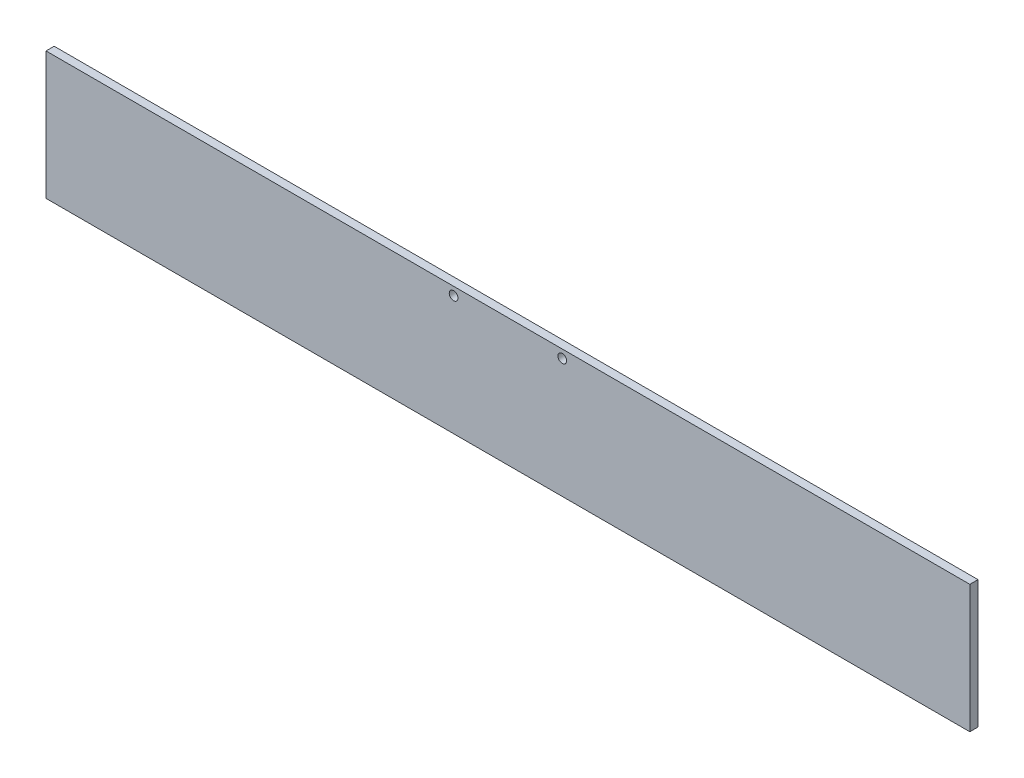
ISO-10303-21;
HEADER;
FILE_DESCRIPTION(('STEP AP214'),'2;1');
FILE_NAME('part.step','',(''),(''),'','','');
FILE_SCHEMA(('AUTOMOTIVE_DESIGN { 1 0 10303 214 1 1 1 1 }'));
ENDSEC;
DATA;
#1=APPLICATION_CONTEXT('core data for automotive mechanical design processes');
#2=APPLICATION_PROTOCOL_DEFINITION('international standard','automotive_design',2000,#1);
#3=PRODUCT_CONTEXT('',#1,'mechanical');
#4=PRODUCT('Part','Part','',(#3));
#5=PRODUCT_RELATED_PRODUCT_CATEGORY('part','',(#4));
#6=PRODUCT_DEFINITION_FORMATION('','',#4);
#7=PRODUCT_DEFINITION_CONTEXT('part definition',#1,'design');
#8=PRODUCT_DEFINITION('design','',#6,#7);
#9=PRODUCT_DEFINITION_SHAPE('','',#8);
#10=(LENGTH_UNIT() NAMED_UNIT(*) SI_UNIT(.MILLI.,.METRE.));
#11=(NAMED_UNIT(*) PLANE_ANGLE_UNIT() SI_UNIT($,.RADIAN.));
#12=(NAMED_UNIT(*) SI_UNIT($,.STERADIAN.) SOLID_ANGLE_UNIT());
#13=UNCERTAINTY_MEASURE_WITH_UNIT(LENGTH_MEASURE(1.E-05),#10,'distance_accuracy_value','');
#14=(GEOMETRIC_REPRESENTATION_CONTEXT(3) GLOBAL_UNCERTAINTY_ASSIGNED_CONTEXT((#13)) GLOBAL_UNIT_ASSIGNED_CONTEXT((#10,
#11,#12)) REPRESENTATION_CONTEXT('',''));
#15=CARTESIAN_POINT('',(0.,0.,0.));
#16=DIRECTION('',(0.,0.,1.));
#17=DIRECTION('',(1.,0.,0.));
#18=AXIS2_PLACEMENT_3D('',#15,#16,#17);
#19=CARTESIAN_POINT('',(0.,0.,3.));
#20=DIRECTION('',(1.,0.,0.));
#21=DIRECTION('',(0.,0.,-1.));
#22=AXIS2_PLACEMENT_3D('',#19,#20,#21);
#23=PLANE('',#22);
#24=DIRECTION('',(0.,-1.,0.));
#25=VECTOR('',#24,1.);
#26=CARTESIAN_POINT('',(0.,0.,0.));
#27=LINE('',#26,#25);
#28=CARTESIAN_POINT('',(0.,47.,0.));
#29=VERTEX_POINT('',#28);
#30=CARTESIAN_POINT('',(0.,0.,0.));
#31=VERTEX_POINT('',#30);
#32=EDGE_CURVE('E100',#29,#31,#27,.T.);
#33=ORIENTED_EDGE('',*,*,#32,.T.);
#34=DIRECTION('',(0.,0.,-1.));
#35=VECTOR('',#34,1.);
#36=CARTESIAN_POINT('',(0.,0.,3.));
#37=LINE('',#36,#35);
#38=CARTESIAN_POINT('',(0.,0.,3.));
#39=VERTEX_POINT('',#38);
#40=EDGE_CURVE('E11',#39,#31,#37,.T.);
#41=ORIENTED_EDGE('',*,*,#40,.F.);
#42=DIRECTION('',(0.,-1.,0.));
#43=VECTOR('',#42,1.);
#44=CARTESIAN_POINT('',(0.,0.,3.));
#45=LINE('',#44,#43);
#46=CARTESIAN_POINT('',(0.,47.,3.));
#47=VERTEX_POINT('',#46);
#48=EDGE_CURVE('E88',#47,#39,#45,.T.);
#49=ORIENTED_EDGE('',*,*,#48,.F.);
#50=DIRECTION('',(0.,0.,-1.));
#51=VECTOR('',#50,1.);
#52=CARTESIAN_POINT('',(0.,47.,3.));
#53=LINE('',#52,#51);
#54=EDGE_CURVE('E96',#47,#29,#53,.T.);
#55=ORIENTED_EDGE('',*,*,#54,.T.);
#56=EDGE_LOOP('',(#33,#41,#49,#55));
#57=FACE_BOUND('',#56,.T.);
#58=ADVANCED_FACE('F37',(#57),#23,.F.);
#59=CARTESIAN_POINT('',(0.,0.,3.));
#60=DIRECTION('',(0.,1.,0.));
#61=DIRECTION('',(0.,0.,1.));
#62=AXIS2_PLACEMENT_3D('',#59,#60,#61);
#63=PLANE('',#62);
#64=DIRECTION('',(1.,0.,0.));
#65=VECTOR('',#64,1.);
#66=CARTESIAN_POINT('',(0.,0.,0.));
#67=LINE('',#66,#65);
#68=CARTESIAN_POINT('',(340.,0.,0.));
#69=VERTEX_POINT('',#68);
#70=EDGE_CURVE('E92',#31,#69,#67,.T.);
#71=ORIENTED_EDGE('',*,*,#70,.T.);
#72=DIRECTION('',(0.,0.,-1.));
#73=VECTOR('',#72,1.);
#74=CARTESIAN_POINT('',(340.,0.,3.));
#75=LINE('',#74,#73);
#76=CARTESIAN_POINT('',(340.,0.,3.));
#77=VERTEX_POINT('',#76);
#78=EDGE_CURVE('E45',#77,#69,#75,.T.);
#79=ORIENTED_EDGE('',*,*,#78,.F.);
#80=DIRECTION('',(1.,0.,0.));
#81=VECTOR('',#80,1.);
#82=CARTESIAN_POINT('',(0.,0.,3.));
#83=LINE('',#82,#81);
#84=EDGE_CURVE('E83',#39,#77,#83,.T.);
#85=ORIENTED_EDGE('',*,*,#84,.F.);
#86=ORIENTED_EDGE('',*,*,#40,.T.);
#87=EDGE_LOOP('',(#71,#79,#85,#86));
#88=FACE_BOUND('',#87,.T.);
#89=ADVANCED_FACE('F91',(#88),#63,.F.);
#90=CARTESIAN_POINT('',(340.,0.,3.));
#91=DIRECTION('',(-1.,0.,0.));
#92=DIRECTION('',(0.,0.,1.));
#93=AXIS2_PLACEMENT_3D('',#90,#91,#92);
#94=PLANE('',#93);
#95=DIRECTION('',(0.,1.,0.));
#96=VECTOR('',#95,1.);
#97=CARTESIAN_POINT('',(340.,0.,0.));
#98=LINE('',#97,#96);
#99=CARTESIAN_POINT('',(340.,47.,0.));
#100=VERTEX_POINT('',#99);
#101=EDGE_CURVE('E70',#69,#100,#98,.T.);
#102=ORIENTED_EDGE('',*,*,#101,.T.);
#103=DIRECTION('',(0.,0.,-1.));
#104=VECTOR('',#103,1.);
#105=CARTESIAN_POINT('',(340.,47.,3.));
#106=LINE('',#105,#104);
#107=CARTESIAN_POINT('',(340.,47.,3.));
#108=VERTEX_POINT('',#107);
#109=EDGE_CURVE('E93',#108,#100,#106,.T.);
#110=ORIENTED_EDGE('',*,*,#109,.F.);
#111=DIRECTION('',(0.,1.,0.));
#112=VECTOR('',#111,1.);
#113=CARTESIAN_POINT('',(340.,0.,3.));
#114=LINE('',#113,#112);
#115=EDGE_CURVE('E86',#77,#108,#114,.T.);
#116=ORIENTED_EDGE('',*,*,#115,.F.);
#117=ORIENTED_EDGE('',*,*,#78,.T.);
#118=EDGE_LOOP('',(#102,#110,#116,#117));
#119=FACE_BOUND('',#118,.T.);
#120=ADVANCED_FACE('F94',(#119),#94,.F.);
#121=CARTESIAN_POINT('',(0.,47.,3.));
#122=DIRECTION('',(0.,-1.,0.));
#123=DIRECTION('',(0.,0.,-1.));
#124=AXIS2_PLACEMENT_3D('',#121,#122,#123);
#125=PLANE('',#124);
#126=DIRECTION('',(-1.,0.,0.));
#127=VECTOR('',#126,1.);
#128=CARTESIAN_POINT('',(0.,47.,0.));
#129=LINE('',#128,#127);
#130=EDGE_CURVE('E76',#100,#29,#129,.T.);
#131=ORIENTED_EDGE('',*,*,#130,.T.);
#132=ORIENTED_EDGE('',*,*,#54,.F.);
#133=DIRECTION('',(-1.,0.,0.));
#134=VECTOR('',#133,1.);
#135=CARTESIAN_POINT('',(0.,47.,3.));
#136=LINE('',#135,#134);
#137=EDGE_CURVE('E53',#108,#47,#136,.T.);
#138=ORIENTED_EDGE('',*,*,#137,.F.);
#139=ORIENTED_EDGE('',*,*,#109,.T.);
#140=EDGE_LOOP('',(#131,#132,#138,#139));
#141=FACE_BOUND('',#140,.T.);
#142=ADVANCED_FACE('F108',(#141),#125,.F.);
#143=CARTESIAN_POINT('',(0.,0.,3.));
#144=DIRECTION('',(0.,0.,-1.));
#145=DIRECTION('',(-1.,0.,0.));
#146=AXIS2_PLACEMENT_3D('',#143,#144,#145);
#147=PLANE('',#146);
#148=CARTESIAN_POINT('',(150.000000000003,43.9999999999996,3.));
#149=DIRECTION('',(0.,0.,-1.));
#150=DIRECTION('',(-1.,0.,0.));
#151=AXIS2_PLACEMENT_3D('',#148,#149,#150);
#152=CIRCLE('',#151,1.59999999999999);
#153=CARTESIAN_POINT('',(148.400000000003,43.9999999999996,3.));
#154=VERTEX_POINT('',#153);
#155=EDGE_CURVE('E103',#154,#154,#152,.F.);
#156=ORIENTED_EDGE('',*,*,#155,.F.);
#157=EDGE_LOOP('',(#156));
#158=FACE_BOUND('',#157,.T.);
#159=CARTESIAN_POINT('',(190.000000000003,43.9999999999996,3.));
#160=DIRECTION('',(0.,0.,-1.));
#161=DIRECTION('',(-1.,0.,0.));
#162=AXIS2_PLACEMENT_3D('',#159,#160,#161);
#163=CIRCLE('',#162,1.59999999999999);
#164=CARTESIAN_POINT('',(188.400000000003,43.9999999999996,3.));
#165=VERTEX_POINT('',#164);
#166=EDGE_CURVE('E118',#165,#165,#163,.F.);
#167=ORIENTED_EDGE('',*,*,#166,.F.);
#168=EDGE_LOOP('',(#167));
#169=FACE_BOUND('',#168,.T.);
#170=ORIENTED_EDGE('',*,*,#48,.T.);
#171=ORIENTED_EDGE('',*,*,#84,.T.);
#172=ORIENTED_EDGE('',*,*,#115,.T.);
#173=ORIENTED_EDGE('',*,*,#137,.T.);
#174=EDGE_LOOP('',(#170,#171,#172,#173));
#175=FACE_BOUND('',#174,.T.);
#176=ADVANCED_FACE('F84',(#158,#169,#175),#147,.F.);
#177=CARTESIAN_POINT('',(0.,0.,0.));
#178=DIRECTION('',(0.,0.,-1.));
#179=DIRECTION('',(-1.,0.,0.));
#180=AXIS2_PLACEMENT_3D('',#177,#178,#179);
#181=PLANE('',#180);
#182=CARTESIAN_POINT('',(150.000000000003,43.9999999999996,0.));
#183=DIRECTION('',(0.,0.,-1.));
#184=DIRECTION('',(-1.,0.,0.));
#185=AXIS2_PLACEMENT_3D('',#182,#183,#184);
#186=CIRCLE('',#185,1.59999999999999);
#187=CARTESIAN_POINT('',(148.400000000003,43.9999999999996,0.));
#188=VERTEX_POINT('',#187);
#189=EDGE_CURVE('E117',#188,#188,#186,.T.);
#190=ORIENTED_EDGE('',*,*,#189,.F.);
#191=EDGE_LOOP('',(#190));
#192=FACE_BOUND('',#191,.T.);
#193=CARTESIAN_POINT('',(190.000000000003,43.9999999999996,0.));
#194=DIRECTION('',(0.,0.,-1.));
#195=DIRECTION('',(-1.,0.,0.));
#196=AXIS2_PLACEMENT_3D('',#193,#194,#195);
#197=CIRCLE('',#196,1.59999999999999);
#198=CARTESIAN_POINT('',(188.400000000003,43.9999999999996,0.));
#199=VERTEX_POINT('',#198);
#200=EDGE_CURVE('E114',#199,#199,#197,.T.);
#201=ORIENTED_EDGE('',*,*,#200,.F.);
#202=EDGE_LOOP('',(#201));
#203=FACE_BOUND('',#202,.T.);
#204=ORIENTED_EDGE('',*,*,#32,.F.);
#205=ORIENTED_EDGE('',*,*,#130,.F.);
#206=ORIENTED_EDGE('',*,*,#101,.F.);
#207=ORIENTED_EDGE('',*,*,#70,.F.);
#208=EDGE_LOOP('',(#204,#205,#206,#207));
#209=FACE_BOUND('',#208,.T.);
#210=ADVANCED_FACE('F111',(#192,#203,#209),#181,.T.);
#211=CARTESIAN_POINT('',(190.000000000003,43.9999999999996,3.001));
#212=DIRECTION('',(0.,0.,-1.));
#213=DIRECTION('',(-1.,0.,0.));
#214=AXIS2_PLACEMENT_3D('',#211,#212,#213);
#215=CYLINDRICAL_SURFACE('',#214,1.59999999999999);
#216=CARTESIAN_POINT('',(188.400000000003,43.9999999999996,0.));
#217=CARTESIAN_POINT('',(188.400000000003,43.9999999999996,0.0312500000000005));
#218=CARTESIAN_POINT('',(188.400000000003,43.9999999999996,0.0625000000000005));
#219=CARTESIAN_POINT('',(188.400000000003,43.9999999999996,0.125000000000001));
#220=CARTESIAN_POINT('',(188.400000000003,43.9999999999996,0.156250000000001));
#221=CARTESIAN_POINT('',(188.400000000003,43.9999999999996,0.218750000000001));
#222=CARTESIAN_POINT('',(188.400000000003,43.9999999999996,0.250000000000001));
#223=CARTESIAN_POINT('',(188.400000000003,43.9999999999996,0.312500000000001));
#224=CARTESIAN_POINT('',(188.400000000003,43.9999999999996,0.34375));
#225=CARTESIAN_POINT('',(188.400000000003,43.9999999999996,0.40625));
#226=CARTESIAN_POINT('',(188.400000000003,43.9999999999996,0.4375));
#227=CARTESIAN_POINT('',(188.400000000003,43.9999999999996,0.5));
#228=CARTESIAN_POINT('',(188.400000000003,43.9999999999996,0.53125));
#229=CARTESIAN_POINT('',(188.400000000003,43.9999999999996,0.593750000000001));
#230=CARTESIAN_POINT('',(188.400000000003,43.9999999999996,0.625000000000001));
#231=CARTESIAN_POINT('',(188.400000000003,43.9999999999996,0.687500000000001));
#232=CARTESIAN_POINT('',(188.400000000003,43.9999999999996,0.71875));
#233=CARTESIAN_POINT('',(188.400000000003,43.9999999999996,0.78125));
#234=CARTESIAN_POINT('',(188.400000000003,43.9999999999996,0.8125));
#235=CARTESIAN_POINT('',(188.400000000003,43.9999999999996,0.875));
#236=CARTESIAN_POINT('',(188.400000000003,43.9999999999996,0.90625));
#237=CARTESIAN_POINT('',(188.400000000003,43.9999999999996,0.96875));
#238=CARTESIAN_POINT('',(188.400000000003,43.9999999999996,1.));
#239=CARTESIAN_POINT('',(188.400000000003,43.9999999999996,1.0625));
#240=CARTESIAN_POINT('',(188.400000000003,43.9999999999996,1.09375));
#241=CARTESIAN_POINT('',(188.400000000003,43.9999999999996,1.15625));
#242=CARTESIAN_POINT('',(188.400000000003,43.9999999999996,1.1875));
#243=CARTESIAN_POINT('',(188.400000000003,43.9999999999996,1.25));
#244=CARTESIAN_POINT('',(188.400000000003,43.9999999999996,1.28125));
#245=CARTESIAN_POINT('',(188.400000000003,43.9999999999996,1.34375));
#246=CARTESIAN_POINT('',(188.400000000003,43.9999999999996,1.375));
#247=CARTESIAN_POINT('',(188.400000000003,43.9999999999996,1.4375));
#248=CARTESIAN_POINT('',(188.400000000003,43.9999999999996,1.46875));
#249=CARTESIAN_POINT('',(188.400000000003,43.9999999999996,1.53125));
#250=CARTESIAN_POINT('',(188.400000000003,43.9999999999996,1.5625));
#251=CARTESIAN_POINT('',(188.400000000003,43.9999999999996,1.625));
#252=CARTESIAN_POINT('',(188.400000000003,43.9999999999996,1.65625));
#253=CARTESIAN_POINT('',(188.400000000003,43.9999999999996,1.71875));
#254=CARTESIAN_POINT('',(188.400000000003,43.9999999999996,1.75));
#255=CARTESIAN_POINT('',(188.400000000003,43.9999999999996,1.8125));
#256=CARTESIAN_POINT('',(188.400000000003,43.9999999999996,1.84375));
#257=CARTESIAN_POINT('',(188.400000000003,43.9999999999996,1.90625));
#258=CARTESIAN_POINT('',(188.400000000003,43.9999999999996,1.9375));
#259=CARTESIAN_POINT('',(188.400000000003,43.9999999999996,2.));
#260=CARTESIAN_POINT('',(188.400000000003,43.9999999999996,2.03125));
#261=CARTESIAN_POINT('',(188.400000000003,43.9999999999996,2.09375));
#262=CARTESIAN_POINT('',(188.400000000003,43.9999999999996,2.125));
#263=CARTESIAN_POINT('',(188.400000000003,43.9999999999996,2.1875));
#264=CARTESIAN_POINT('',(188.400000000003,43.9999999999996,2.21875));
#265=CARTESIAN_POINT('',(188.400000000003,43.9999999999996,2.28125));
#266=CARTESIAN_POINT('',(188.400000000003,43.9999999999996,2.3125));
#267=CARTESIAN_POINT('',(188.400000000003,43.9999999999996,2.375));
#268=CARTESIAN_POINT('',(188.400000000003,43.9999999999996,2.40625));
#269=CARTESIAN_POINT('',(188.400000000003,43.9999999999996,2.46875));
#270=CARTESIAN_POINT('',(188.400000000003,43.9999999999996,2.5));
#271=CARTESIAN_POINT('',(188.400000000003,43.9999999999996,2.5625));
#272=CARTESIAN_POINT('',(188.400000000003,43.9999999999996,2.59375));
#273=CARTESIAN_POINT('',(188.400000000003,43.9999999999996,2.65625));
#274=CARTESIAN_POINT('',(188.400000000003,43.9999999999996,2.6875));
#275=CARTESIAN_POINT('',(188.400000000003,43.9999999999996,2.75));
#276=CARTESIAN_POINT('',(188.400000000003,43.9999999999996,2.78125));
#277=CARTESIAN_POINT('',(188.400000000003,43.9999999999996,2.84375));
#278=CARTESIAN_POINT('',(188.400000000003,43.9999999999996,2.875));
#279=CARTESIAN_POINT('',(188.400000000003,43.9999999999996,2.9375));
#280=CARTESIAN_POINT('',(188.400000000003,43.9999999999996,2.96875));
#281=CARTESIAN_POINT('',(188.400000000003,43.9999999999996,3.));
#282=B_SPLINE_CURVE_WITH_KNOTS('',3,(#216,#217,#218,#219,#220,#221,#222,#223,#224,#225,#226,
#227,#228,#229,#230,#231,#232,#233,#234,#235,#236,#237,#238,#239,#240,#241,#242,#243,#244,#245,
#246,#247,#248,#249,#250,#251,#252,#253,#254,#255,#256,#257,#258,#259,#260,#261,#262,#263,#264,
#265,#266,#267,#268,#269,#270,#271,#272,#273,#274,#275,#276,#277,#278,#279,#280,#281),
.UNSPECIFIED.,.F.,.F.,(4,2,2,2,2,2,2,2,2,2,2,2,2,2,2,2,2,2,2,2,2,2,2,2,2,2,2,2,2,2,2,2,4),(0.,
0.0937500000000001,0.1875,0.28125,0.375,0.46875,0.5625,0.65625,0.75,0.84375,0.9375,1.03125,
1.125,1.21875,1.3125,1.40625,1.5,1.59375,1.6875,1.78125,1.875,1.96875,2.0625,2.15625,2.25,
2.34375,2.4375,2.53125,2.625,2.71875,2.8125,2.90625,3.),.UNSPECIFIED.);
#283=EDGE_CURVE('BSEAM131',#199,#165,#282,.T.);
#284=ORIENTED_EDGE('',*,*,#200,.T.);
#285=ORIENTED_EDGE('',*,*,#166,.T.);
#286=ORIENTED_EDGE('',*,*,#283,.T.);
#287=ORIENTED_EDGE('',*,*,#283,.F.);
#288=EDGE_LOOP('',(#284,#286,#285,#287));
#289=FACE_BOUND('',#288,.T.);
#290=ADVANCED_FACE('F131',(#289),#215,.F.);
#291=CARTESIAN_POINT('',(150.000000000003,43.9999999999996,3.001));
#292=DIRECTION('',(0.,0.,-1.));
#293=DIRECTION('',(-1.,0.,0.));
#294=AXIS2_PLACEMENT_3D('',#291,#292,#293);
#295=CYLINDRICAL_SURFACE('',#294,1.59999999999999);
#296=CARTESIAN_POINT('',(148.400000000003,43.9999999999996,0.));
#297=CARTESIAN_POINT('',(148.400000000003,43.9999999999996,0.0312500000000005));
#298=CARTESIAN_POINT('',(148.400000000003,43.9999999999996,0.0625000000000005));
#299=CARTESIAN_POINT('',(148.400000000003,43.9999999999996,0.125000000000001));
#300=CARTESIAN_POINT('',(148.400000000003,43.9999999999996,0.156250000000001));
#301=CARTESIAN_POINT('',(148.400000000003,43.9999999999996,0.218750000000001));
#302=CARTESIAN_POINT('',(148.400000000003,43.9999999999996,0.250000000000001));
#303=CARTESIAN_POINT('',(148.400000000003,43.9999999999996,0.312500000000001));
#304=CARTESIAN_POINT('',(148.400000000003,43.9999999999996,0.34375));
#305=CARTESIAN_POINT('',(148.400000000003,43.9999999999996,0.40625));
#306=CARTESIAN_POINT('',(148.400000000003,43.9999999999996,0.4375));
#307=CARTESIAN_POINT('',(148.400000000003,43.9999999999996,0.5));
#308=CARTESIAN_POINT('',(148.400000000003,43.9999999999996,0.53125));
#309=CARTESIAN_POINT('',(148.400000000003,43.9999999999996,0.593750000000001));
#310=CARTESIAN_POINT('',(148.400000000003,43.9999999999996,0.625000000000001));
#311=CARTESIAN_POINT('',(148.400000000003,43.9999999999996,0.687500000000001));
#312=CARTESIAN_POINT('',(148.400000000003,43.9999999999996,0.71875));
#313=CARTESIAN_POINT('',(148.400000000003,43.9999999999996,0.78125));
#314=CARTESIAN_POINT('',(148.400000000003,43.9999999999996,0.8125));
#315=CARTESIAN_POINT('',(148.400000000003,43.9999999999996,0.875));
#316=CARTESIAN_POINT('',(148.400000000003,43.9999999999996,0.90625));
#317=CARTESIAN_POINT('',(148.400000000003,43.9999999999996,0.96875));
#318=CARTESIAN_POINT('',(148.400000000003,43.9999999999996,1.));
#319=CARTESIAN_POINT('',(148.400000000003,43.9999999999996,1.0625));
#320=CARTESIAN_POINT('',(148.400000000003,43.9999999999996,1.09375));
#321=CARTESIAN_POINT('',(148.400000000003,43.9999999999996,1.15625));
#322=CARTESIAN_POINT('',(148.400000000003,43.9999999999996,1.1875));
#323=CARTESIAN_POINT('',(148.400000000003,43.9999999999996,1.25));
#324=CARTESIAN_POINT('',(148.400000000003,43.9999999999996,1.28125));
#325=CARTESIAN_POINT('',(148.400000000003,43.9999999999996,1.34375));
#326=CARTESIAN_POINT('',(148.400000000003,43.9999999999996,1.375));
#327=CARTESIAN_POINT('',(148.400000000003,43.9999999999996,1.4375));
#328=CARTESIAN_POINT('',(148.400000000003,43.9999999999996,1.46875));
#329=CARTESIAN_POINT('',(148.400000000003,43.9999999999996,1.53125));
#330=CARTESIAN_POINT('',(148.400000000003,43.9999999999996,1.5625));
#331=CARTESIAN_POINT('',(148.400000000003,43.9999999999996,1.625));
#332=CARTESIAN_POINT('',(148.400000000003,43.9999999999996,1.65625));
#333=CARTESIAN_POINT('',(148.400000000003,43.9999999999996,1.71875));
#334=CARTESIAN_POINT('',(148.400000000003,43.9999999999996,1.75));
#335=CARTESIAN_POINT('',(148.400000000003,43.9999999999996,1.8125));
#336=CARTESIAN_POINT('',(148.400000000003,43.9999999999996,1.84375));
#337=CARTESIAN_POINT('',(148.400000000003,43.9999999999996,1.90625));
#338=CARTESIAN_POINT('',(148.400000000003,43.9999999999996,1.9375));
#339=CARTESIAN_POINT('',(148.400000000003,43.9999999999996,2.));
#340=CARTESIAN_POINT('',(148.400000000003,43.9999999999996,2.03125));
#341=CARTESIAN_POINT('',(148.400000000003,43.9999999999996,2.09375));
#342=CARTESIAN_POINT('',(148.400000000003,43.9999999999996,2.125));
#343=CARTESIAN_POINT('',(148.400000000003,43.9999999999996,2.1875));
#344=CARTESIAN_POINT('',(148.400000000003,43.9999999999996,2.21875));
#345=CARTESIAN_POINT('',(148.400000000003,43.9999999999996,2.28125));
#346=CARTESIAN_POINT('',(148.400000000003,43.9999999999996,2.3125));
#347=CARTESIAN_POINT('',(148.400000000003,43.9999999999996,2.375));
#348=CARTESIAN_POINT('',(148.400000000003,43.9999999999996,2.40625));
#349=CARTESIAN_POINT('',(148.400000000003,43.9999999999996,2.46875));
#350=CARTESIAN_POINT('',(148.400000000003,43.9999999999996,2.5));
#351=CARTESIAN_POINT('',(148.400000000003,43.9999999999996,2.5625));
#352=CARTESIAN_POINT('',(148.400000000003,43.9999999999996,2.59375));
#353=CARTESIAN_POINT('',(148.400000000003,43.9999999999996,2.65625));
#354=CARTESIAN_POINT('',(148.400000000003,43.9999999999996,2.6875));
#355=CARTESIAN_POINT('',(148.400000000003,43.9999999999996,2.75));
#356=CARTESIAN_POINT('',(148.400000000003,43.9999999999996,2.78125));
#357=CARTESIAN_POINT('',(148.400000000003,43.9999999999996,2.84375));
#358=CARTESIAN_POINT('',(148.400000000003,43.9999999999996,2.875));
#359=CARTESIAN_POINT('',(148.400000000003,43.9999999999996,2.9375));
#360=CARTESIAN_POINT('',(148.400000000003,43.9999999999996,2.96875));
#361=CARTESIAN_POINT('',(148.400000000003,43.9999999999996,3.));
#362=B_SPLINE_CURVE_WITH_KNOTS('',3,(#296,#297,#298,#299,#300,#301,#302,#303,#304,#305,#306,
#307,#308,#309,#310,#311,#312,#313,#314,#315,#316,#317,#318,#319,#320,#321,#322,#323,#324,#325,
#326,#327,#328,#329,#330,#331,#332,#333,#334,#335,#336,#337,#338,#339,#340,#341,#342,#343,#344,
#345,#346,#347,#348,#349,#350,#351,#352,#353,#354,#355,#356,#357,#358,#359,#360,#361),
.UNSPECIFIED.,.F.,.F.,(4,2,2,2,2,2,2,2,2,2,2,2,2,2,2,2,2,2,2,2,2,2,2,2,2,2,2,2,2,2,2,2,4),(0.,
0.0937500000000001,0.1875,0.28125,0.375,0.46875,0.5625,0.65625,0.75,0.84375,0.9375,1.03125,
1.125,1.21875,1.3125,1.40625,1.5,1.59375,1.6875,1.78125,1.875,1.96875,2.0625,2.15625,2.25,
2.34375,2.4375,2.53125,2.625,2.71875,2.8125,2.90625,3.),.UNSPECIFIED.);
#363=EDGE_CURVE('BSEAM126',#188,#154,#362,.T.);
#364=ORIENTED_EDGE('',*,*,#189,.T.);
#365=ORIENTED_EDGE('',*,*,#155,.T.);
#366=ORIENTED_EDGE('',*,*,#363,.T.);
#367=ORIENTED_EDGE('',*,*,#363,.F.);
#368=EDGE_LOOP('',(#364,#366,#365,#367));
#369=FACE_BOUND('',#368,.T.);
#370=ADVANCED_FACE('F126',(#369),#295,.F.);
#371=CLOSED_SHELL('',(#58,#89,#120,#142,#176,#210,#290,#370));
#372=MANIFOLD_SOLID_BREP('B2',#371);
#373=ADVANCED_BREP_SHAPE_REPRESENTATION('',(#18,#372),#14);
#374=SHAPE_DEFINITION_REPRESENTATION(#9,#373);
ENDSEC;
END-ISO-10303-21;
